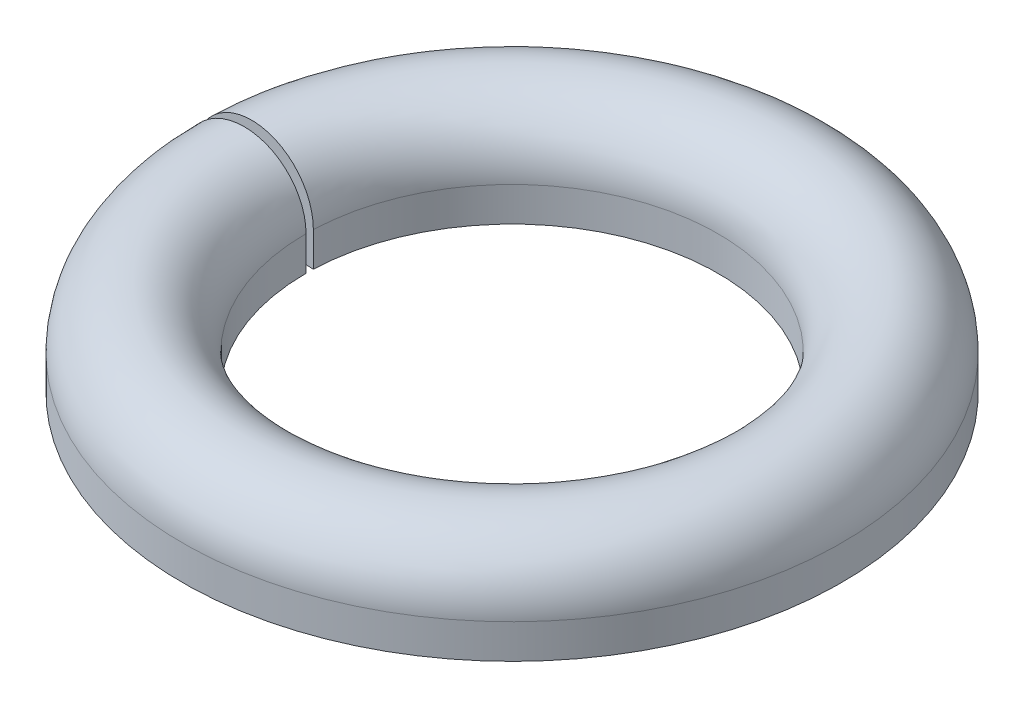
ISO-10303-21;
HEADER;
FILE_DESCRIPTION(('STEP AP214'),'2;1');
FILE_NAME('part.step','',(''),(''),'','','');
FILE_SCHEMA(('AUTOMOTIVE_DESIGN { 1 0 10303 214 1 1 1 1 }'));
ENDSEC;
DATA;
#1=APPLICATION_CONTEXT('core data for automotive mechanical design processes');
#2=APPLICATION_PROTOCOL_DEFINITION('international standard','automotive_design',2000,#1);
#3=PRODUCT_CONTEXT('',#1,'mechanical');
#4=PRODUCT('Part','Part','',(#3));
#5=PRODUCT_RELATED_PRODUCT_CATEGORY('part','',(#4));
#6=PRODUCT_DEFINITION_FORMATION('','',#4);
#7=PRODUCT_DEFINITION_CONTEXT('part definition',#1,'design');
#8=PRODUCT_DEFINITION('design','',#6,#7);
#9=PRODUCT_DEFINITION_SHAPE('','',#8);
#10=(LENGTH_UNIT() NAMED_UNIT(*) SI_UNIT(.MILLI.,.METRE.));
#11=(NAMED_UNIT(*) PLANE_ANGLE_UNIT() SI_UNIT($,.RADIAN.));
#12=(NAMED_UNIT(*) SI_UNIT($,.STERADIAN.) SOLID_ANGLE_UNIT());
#13=UNCERTAINTY_MEASURE_WITH_UNIT(LENGTH_MEASURE(1.E-05),#10,'distance_accuracy_value','');
#14=(GEOMETRIC_REPRESENTATION_CONTEXT(3) GLOBAL_UNCERTAINTY_ASSIGNED_CONTEXT((#13)) GLOBAL_UNIT_ASSIGNED_CONTEXT((#10,
#11,#12)) REPRESENTATION_CONTEXT('',''));
#15=CARTESIAN_POINT('',(0.,0.,0.));
#16=DIRECTION('',(0.,0.,1.));
#17=DIRECTION('',(1.,0.,0.));
#18=AXIS2_PLACEMENT_3D('',#15,#16,#17);
#19=CARTESIAN_POINT('',(0.,2.5,0.));
#20=DIRECTION('',(0.,-1.,0.));
#21=DIRECTION('',(0.,0.,-1.));
#22=AXIS2_PLACEMENT_3D('',#19,#20,#21);
#23=TOROIDAL_SURFACE('',#22,19.5,3.);
#24=CARTESIAN_POINT('',(0.,2.5,0.));
#25=DIRECTION('',(0.,-1.,0.));
#26=DIRECTION('',(0.,0.,-1.));
#27=AXIS2_PLACEMENT_3D('',#24,#25,#26);
#28=CIRCLE('',#27,22.5);
#29=CARTESIAN_POINT('',(-22.4862936079297,2.5,-0.785238675805969));
#30=VERTEX_POINT('',#29);
#31=CARTESIAN_POINT('',(-22.5,2.5,0.));
#32=VERTEX_POINT('',#31);
#33=EDGE_CURVE('E11',#30,#32,#28,.T.);
#34=ORIENTED_EDGE('',*,*,#33,.T.);
#35=CARTESIAN_POINT('',(-19.5,2.5,0.));
#36=DIRECTION('',(0.,0.,1.));
#37=DIRECTION('',(-1.,0.,0.));
#38=AXIS2_PLACEMENT_3D('',#35,#36,#37);
#39=CIRCLE('',#38,3.);
#40=CARTESIAN_POINT('',(-16.5,2.5,0.));
#41=VERTEX_POINT('',#40);
#42=EDGE_CURVE('E142',#41,#32,#39,.T.);
#43=ORIENTED_EDGE('',*,*,#42,.F.);
#44=CARTESIAN_POINT('',(0.,2.5,0.));
#45=DIRECTION('',(0.,-1.,0.));
#46=DIRECTION('',(0.,0.,-1.));
#47=AXIS2_PLACEMENT_3D('',#44,#45,#46);
#48=CIRCLE('',#47,16.5);
#49=CARTESIAN_POINT('',(-16.4899486458151,2.5,-0.575841695591044));
#50=VERTEX_POINT('',#49);
#51=EDGE_CURVE('E191',#50,#41,#48,.T.);
#52=ORIENTED_EDGE('',*,*,#51,.F.);
#53=CARTESIAN_POINT('',(-19.4881211268724,2.5,-0.680540185698506));
#54=DIRECTION('',(-0.0348994967024875,0.,0.999390827019096));
#55=DIRECTION('',(-0.999390827019096,0.,-0.0348994967024875));
#56=AXIS2_PLACEMENT_3D('',#53,#54,#55);
#57=CIRCLE('',#56,3.);
#58=EDGE_CURVE('E171',#50,#30,#57,.T.);
#59=ORIENTED_EDGE('',*,*,#58,.T.);
#60=EDGE_LOOP('',(#34,#43,#52,#59));
#61=FACE_BOUND('',#60,.T.);
#62=ADVANCED_FACE('F41',(#61),#23,.F.);
#63=CARTESIAN_POINT('',(0.,0.,0.));
#64=DIRECTION('',(0.,-1.,0.));
#65=DIRECTION('',(0.,0.,-1.));
#66=AXIS2_PLACEMENT_3D('',#63,#64,#65);
#67=CYLINDRICAL_SURFACE('',#66,22.5);
#68=CARTESIAN_POINT('',(0.,1.5,0.));
#69=DIRECTION('',(0.,-1.,0.));
#70=DIRECTION('',(0.,0.,-1.));
#71=AXIS2_PLACEMENT_3D('',#68,#69,#70);
#72=CIRCLE('',#71,22.5);
#73=CARTESIAN_POINT('',(-22.4862936079297,1.5,-0.785238675805969));
#74=VERTEX_POINT('',#73);
#75=CARTESIAN_POINT('',(-22.5,1.5,0.));
#76=VERTEX_POINT('',#75);
#77=EDGE_CURVE('E50',#74,#76,#72,.T.);
#78=ORIENTED_EDGE('',*,*,#77,.T.);
#79=DIRECTION('',(0.,-1.,0.));
#80=VECTOR('',#79,1.);
#81=CARTESIAN_POINT('',(-22.5,1.5,0.));
#82=LINE('',#81,#80);
#83=EDGE_CURVE('E154',#32,#76,#82,.T.);
#84=ORIENTED_EDGE('',*,*,#83,.F.);
#85=ORIENTED_EDGE('',*,*,#33,.F.);
#86=DIRECTION('',(0.,-1.,0.));
#87=VECTOR('',#86,1.);
#88=CARTESIAN_POINT('',(-22.4862936079297,1.5,-0.785238675805969));
#89=LINE('',#88,#87);
#90=EDGE_CURVE('E119',#30,#74,#89,.T.);
#91=ORIENTED_EDGE('',*,*,#90,.T.);
#92=EDGE_LOOP('',(#78,#84,#85,#91));
#93=FACE_BOUND('',#92,.T.);
#94=ADVANCED_FACE('F43',(#93),#67,.F.);
#95=CARTESIAN_POINT('',(-16.4899486458151,1.5,-0.575841695591044));
#96=DIRECTION('',(0.,1.,0.));
#97=DIRECTION('',(0.,0.,1.));
#98=AXIS2_PLACEMENT_3D('',#95,#96,#97);
#99=PLANE('',#98);
#100=CARTESIAN_POINT('',(0.,1.5,0.));
#101=DIRECTION('',(0.,-1.,0.));
#102=DIRECTION('',(0.,0.,-1.));
#103=AXIS2_PLACEMENT_3D('',#100,#101,#102);
#104=CIRCLE('',#103,16.5);
#105=CARTESIAN_POINT('',(-16.4899486458151,1.5,-0.575841695591044));
#106=VERTEX_POINT('',#105);
#107=CARTESIAN_POINT('',(-16.5,1.5,0.));
#108=VERTEX_POINT('',#107);
#109=EDGE_CURVE('E194',#106,#108,#104,.T.);
#110=ORIENTED_EDGE('',*,*,#109,.T.);
#111=DIRECTION('',(1.,0.,0.));
#112=VECTOR('',#111,1.);
#113=CARTESIAN_POINT('',(-16.5,1.5,0.));
#114=LINE('',#113,#112);
#115=EDGE_CURVE('E150',#76,#108,#114,.T.);
#116=ORIENTED_EDGE('',*,*,#115,.F.);
#117=ORIENTED_EDGE('',*,*,#77,.F.);
#118=DIRECTION('',(0.999390827019096,0.,0.0348994967024875));
#119=VECTOR('',#118,1.);
#120=CARTESIAN_POINT('',(-16.4899486458151,1.5,-0.575841695591044));
#121=LINE('',#120,#119);
#122=EDGE_CURVE('E179',#74,#106,#121,.T.);
#123=ORIENTED_EDGE('',*,*,#122,.T.);
#124=EDGE_LOOP('',(#110,#116,#117,#123));
#125=FACE_BOUND('',#124,.T.);
#126=ADVANCED_FACE('F197',(#125),#99,.T.);
#127=CARTESIAN_POINT('',(0.,0.,0.));
#128=DIRECTION('',(0.,-1.,0.));
#129=DIRECTION('',(0.,0.,-1.));
#130=AXIS2_PLACEMENT_3D('',#127,#128,#129);
#131=CYLINDRICAL_SURFACE('',#130,15.);
#132=CARTESIAN_POINT('',(0.,0.,0.));
#133=DIRECTION('',(0.,-1.,0.));
#134=DIRECTION('',(0.,0.,-1.));
#135=AXIS2_PLACEMENT_3D('',#132,#133,#134);
#136=CIRCLE('',#135,15.);
#137=CARTESIAN_POINT('',(-14.9908624052864,0.,-0.523492450537313));
#138=VERTEX_POINT('',#137);
#139=CARTESIAN_POINT('',(-15.,0.,0.));
#140=VERTEX_POINT('',#139);
#141=EDGE_CURVE('E132',#138,#140,#136,.T.);
#142=ORIENTED_EDGE('',*,*,#141,.T.);
#143=DIRECTION('',(0.,1.,0.));
#144=VECTOR('',#143,1.);
#145=CARTESIAN_POINT('',(-15.,0.,0.));
#146=LINE('',#145,#144);
#147=CARTESIAN_POINT('',(-15.,2.5,0.));
#148=VERTEX_POINT('',#147);
#149=EDGE_CURVE('E126',#140,#148,#146,.T.);
#150=ORIENTED_EDGE('',*,*,#149,.T.);
#151=CARTESIAN_POINT('',(0.,2.5,0.));
#152=DIRECTION('',(0.,-1.,0.));
#153=DIRECTION('',(0.,0.,-1.));
#154=AXIS2_PLACEMENT_3D('',#151,#152,#153);
#155=CIRCLE('',#154,15.);
#156=CARTESIAN_POINT('',(-14.9908624052864,2.5,-0.523492450537313));
#157=VERTEX_POINT('',#156);
#158=EDGE_CURVE('E106',#157,#148,#155,.T.);
#159=ORIENTED_EDGE('',*,*,#158,.F.);
#160=DIRECTION('',(0.,1.,0.));
#161=VECTOR('',#160,1.);
#162=CARTESIAN_POINT('',(-14.9908624052864,0.,-0.523492450537313));
#163=LINE('',#162,#161);
#164=EDGE_CURVE('E158',#138,#157,#163,.T.);
#165=ORIENTED_EDGE('',*,*,#164,.F.);
#166=EDGE_LOOP('',(#142,#150,#159,#165));
#167=FACE_BOUND('',#166,.T.);
#168=ADVANCED_FACE('F131',(#167),#131,.F.);
#169=CARTESIAN_POINT('',(-14.9908624052864,0.,-0.523492450537313));
#170=DIRECTION('',(0.,1.,0.));
#171=DIRECTION('',(0.,0.,1.));
#172=AXIS2_PLACEMENT_3D('',#169,#170,#171);
#173=PLANE('',#172);
#174=CARTESIAN_POINT('',(0.,0.,0.));
#175=DIRECTION('',(0.,-1.,0.));
#176=DIRECTION('',(0.,0.,-1.));
#177=AXIS2_PLACEMENT_3D('',#174,#175,#176);
#178=CIRCLE('',#177,24.);
#179=CARTESIAN_POINT('',(-23.9853798484583,0.,-0.8375879208597));
#180=VERTEX_POINT('',#179);
#181=CARTESIAN_POINT('',(-24.,0.,0.));
#182=VERTEX_POINT('',#181);
#183=EDGE_CURVE('E186',#180,#182,#178,.T.);
#184=ORIENTED_EDGE('',*,*,#183,.T.);
#185=DIRECTION('',(1.,0.,0.));
#186=VECTOR('',#185,1.);
#187=CARTESIAN_POINT('',(-15.,0.,0.));
#188=LINE('',#187,#186);
#189=EDGE_CURVE('E139',#182,#140,#188,.T.);
#190=ORIENTED_EDGE('',*,*,#189,.T.);
#191=ORIENTED_EDGE('',*,*,#141,.F.);
#192=DIRECTION('',(0.999390827019096,0.,0.0348994967024875));
#193=VECTOR('',#192,1.);
#194=CARTESIAN_POINT('',(-14.9908624052864,0.,-0.523492450537313));
#195=LINE('',#194,#193);
#196=EDGE_CURVE('E167',#180,#138,#195,.T.);
#197=ORIENTED_EDGE('',*,*,#196,.F.);
#198=EDGE_LOOP('',(#184,#190,#191,#197));
#199=FACE_BOUND('',#198,.T.);
#200=ADVANCED_FACE('F223',(#199),#173,.F.);
#201=CARTESIAN_POINT('',(0.,0.,0.));
#202=DIRECTION('',(0.,-1.,0.));
#203=DIRECTION('',(0.,0.,-1.));
#204=AXIS2_PLACEMENT_3D('',#201,#202,#203);
#205=CYLINDRICAL_SURFACE('',#204,24.);
#206=CARTESIAN_POINT('',(0.,2.5,0.));
#207=DIRECTION('',(0.,-1.,0.));
#208=DIRECTION('',(0.,0.,-1.));
#209=AXIS2_PLACEMENT_3D('',#206,#207,#208);
#210=CIRCLE('',#209,24.);
#211=CARTESIAN_POINT('',(-23.9853798484583,2.5,-0.8375879208597));
#212=VERTEX_POINT('',#211);
#213=CARTESIAN_POINT('',(-24.,2.5,0.));
#214=VERTEX_POINT('',#213);
#215=EDGE_CURVE('E118',#212,#214,#210,.T.);
#216=ORIENTED_EDGE('',*,*,#215,.T.);
#217=DIRECTION('',(0.,-1.,0.));
#218=VECTOR('',#217,1.);
#219=CARTESIAN_POINT('',(-24.,0.,0.));
#220=LINE('',#219,#218);
#221=EDGE_CURVE('E128',#214,#182,#220,.T.);
#222=ORIENTED_EDGE('',*,*,#221,.T.);
#223=ORIENTED_EDGE('',*,*,#183,.F.);
#224=DIRECTION('',(0.,-1.,0.));
#225=VECTOR('',#224,1.);
#226=CARTESIAN_POINT('',(-23.9853798484583,0.,-0.8375879208597));
#227=LINE('',#226,#225);
#228=EDGE_CURVE('E163',#212,#180,#227,.T.);
#229=ORIENTED_EDGE('',*,*,#228,.F.);
#230=EDGE_LOOP('',(#216,#222,#223,#229));
#231=FACE_BOUND('',#230,.T.);
#232=ADVANCED_FACE('F215',(#231),#205,.T.);
#233=CARTESIAN_POINT('',(0.,2.5,0.));
#234=DIRECTION('',(0.,-1.,0.));
#235=DIRECTION('',(0.,0.,-1.));
#236=AXIS2_PLACEMENT_3D('',#233,#234,#235);
#237=TOROIDAL_SURFACE('',#236,19.5,4.5);
#238=CARTESIAN_POINT('',(-19.4881211268724,2.5,-0.680540185698506));
#239=DIRECTION('',(-0.0348994967024875,0.,0.999390827019096));
#240=DIRECTION('',(-0.999390827019096,0.,-0.0348994967024875));
#241=AXIS2_PLACEMENT_3D('',#238,#239,#240);
#242=CIRCLE('',#241,4.5);
#243=EDGE_CURVE('E112',#157,#212,#242,.T.);
#244=ORIENTED_EDGE('',*,*,#243,.F.);
#245=ORIENTED_EDGE('',*,*,#158,.T.);
#246=CARTESIAN_POINT('',(-19.5,2.5,0.));
#247=DIRECTION('',(0.,0.,1.));
#248=DIRECTION('',(-1.,0.,0.));
#249=AXIS2_PLACEMENT_3D('',#246,#247,#248);
#250=CIRCLE('',#249,4.5);
#251=EDGE_CURVE('E109',#148,#214,#250,.T.);
#252=ORIENTED_EDGE('',*,*,#251,.T.);
#253=ORIENTED_EDGE('',*,*,#215,.F.);
#254=EDGE_LOOP('',(#244,#245,#252,#253));
#255=FACE_BOUND('',#254,.T.);
#256=ADVANCED_FACE('F108',(#255),#237,.T.);
#257=CARTESIAN_POINT('',(0.,0.,0.));
#258=DIRECTION('',(0.,-1.,0.));
#259=DIRECTION('',(0.,0.,-1.));
#260=AXIS2_PLACEMENT_3D('',#257,#258,#259);
#261=CYLINDRICAL_SURFACE('',#260,16.5);
#262=DIRECTION('',(0.,1.,0.));
#263=VECTOR('',#262,1.);
#264=CARTESIAN_POINT('',(-16.4899486458151,1.5,-0.575841695591044));
#265=LINE('',#264,#263);
#266=EDGE_CURVE('E175',#106,#50,#265,.T.);
#267=ORIENTED_EDGE('',*,*,#266,.T.);
#268=ORIENTED_EDGE('',*,*,#51,.T.);
#269=DIRECTION('',(0.,1.,0.));
#270=VECTOR('',#269,1.);
#271=CARTESIAN_POINT('',(-16.5,1.5,0.));
#272=LINE('',#271,#270);
#273=EDGE_CURVE('E146',#108,#41,#272,.T.);
#274=ORIENTED_EDGE('',*,*,#273,.F.);
#275=ORIENTED_EDGE('',*,*,#109,.F.);
#276=EDGE_LOOP('',(#267,#268,#274,#275));
#277=FACE_BOUND('',#276,.T.);
#278=ADVANCED_FACE('F206',(#277),#261,.T.);
#279=CARTESIAN_POINT('',(-19.4881211268724,2.5,-0.680540185698506));
#280=DIRECTION('',(0.0348994967024875,0.,-0.999390827019096));
#281=DIRECTION('',(-0.999390827019096,0.,-0.0348994967024875));
#282=AXIS2_PLACEMENT_3D('',#279,#280,#281);
#283=PLANE('',#282);
#284=ORIENTED_EDGE('',*,*,#164,.T.);
#285=ORIENTED_EDGE('',*,*,#243,.T.);
#286=ORIENTED_EDGE('',*,*,#228,.T.);
#287=ORIENTED_EDGE('',*,*,#196,.T.);
#288=EDGE_LOOP('',(#284,#285,#286,#287));
#289=FACE_BOUND('',#288,.T.);
#290=ORIENTED_EDGE('',*,*,#58,.F.);
#291=ORIENTED_EDGE('',*,*,#266,.F.);
#292=ORIENTED_EDGE('',*,*,#122,.F.);
#293=ORIENTED_EDGE('',*,*,#90,.F.);
#294=EDGE_LOOP('',(#290,#291,#292,#293));
#295=FACE_BOUND('',#294,.T.);
#296=ADVANCED_FACE('F204',(#289,#295),#283,.F.);
#297=CARTESIAN_POINT('',(-19.5,2.5,0.));
#298=DIRECTION('',(0.,0.,-1.));
#299=DIRECTION('',(-1.,0.,0.));
#300=AXIS2_PLACEMENT_3D('',#297,#298,#299);
#301=PLANE('',#300);
#302=ORIENTED_EDGE('',*,*,#149,.F.);
#303=ORIENTED_EDGE('',*,*,#189,.F.);
#304=ORIENTED_EDGE('',*,*,#221,.F.);
#305=ORIENTED_EDGE('',*,*,#251,.F.);
#306=EDGE_LOOP('',(#302,#303,#304,#305));
#307=FACE_BOUND('',#306,.T.);
#308=ORIENTED_EDGE('',*,*,#42,.T.);
#309=ORIENTED_EDGE('',*,*,#83,.T.);
#310=ORIENTED_EDGE('',*,*,#115,.T.);
#311=ORIENTED_EDGE('',*,*,#273,.T.);
#312=EDGE_LOOP('',(#308,#309,#310,#311));
#313=FACE_BOUND('',#312,.T.);
#314=ADVANCED_FACE('F123',(#307,#313),#301,.T.);
#315=CLOSED_SHELL('',(#62,#94,#126,#168,#200,#232,#256,#278,#296,#314));
#316=MANIFOLD_SOLID_BREP('B2',#315);
#317=ADVANCED_BREP_SHAPE_REPRESENTATION('',(#18,#316),#14);
#318=SHAPE_DEFINITION_REPRESENTATION(#9,#317);
ENDSEC;
END-ISO-10303-21;
